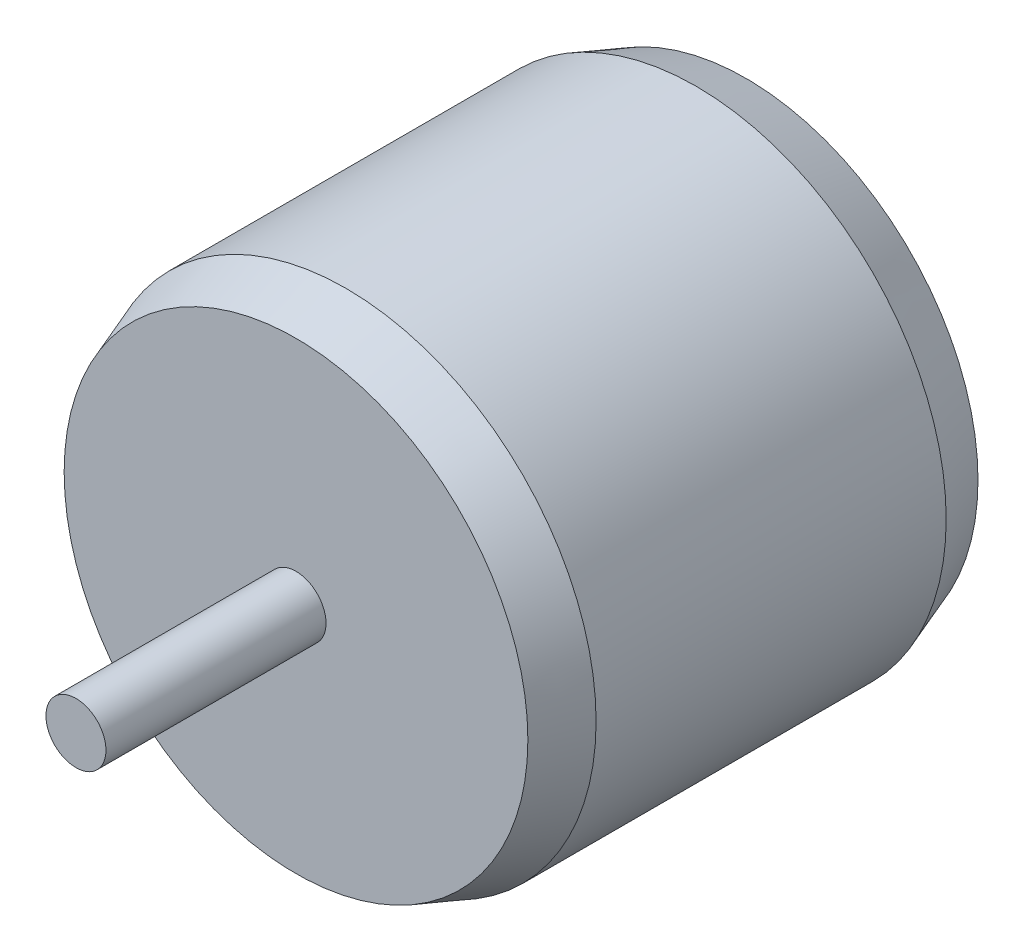
ISO-10303-21;
HEADER;
FILE_DESCRIPTION(('STEP AP214'),'2;1');
FILE_NAME('part.step','',(''),(''),'','','');
FILE_SCHEMA(('AUTOMOTIVE_DESIGN { 1 0 10303 214 1 1 1 1 }'));
ENDSEC;
DATA;
#1=APPLICATION_CONTEXT('core data for automotive mechanical design processes');
#2=APPLICATION_PROTOCOL_DEFINITION('international standard','automotive_design',2000,#1);
#3=PRODUCT_CONTEXT('',#1,'mechanical');
#4=PRODUCT('Part','Part','',(#3));
#5=PRODUCT_RELATED_PRODUCT_CATEGORY('part','',(#4));
#6=PRODUCT_DEFINITION_FORMATION('','',#4);
#7=PRODUCT_DEFINITION_CONTEXT('part definition',#1,'design');
#8=PRODUCT_DEFINITION('design','',#6,#7);
#9=PRODUCT_DEFINITION_SHAPE('','',#8);
#10=(LENGTH_UNIT() NAMED_UNIT(*) SI_UNIT(.MILLI.,.METRE.));
#11=(NAMED_UNIT(*) PLANE_ANGLE_UNIT() SI_UNIT($,.RADIAN.));
#12=(NAMED_UNIT(*) SI_UNIT($,.STERADIAN.) SOLID_ANGLE_UNIT());
#13=UNCERTAINTY_MEASURE_WITH_UNIT(LENGTH_MEASURE(1.E-05),#10,'distance_accuracy_value','');
#14=(GEOMETRIC_REPRESENTATION_CONTEXT(3) GLOBAL_UNCERTAINTY_ASSIGNED_CONTEXT((#13)) GLOBAL_UNIT_ASSIGNED_CONTEXT((#10,
#11,#12)) REPRESENTATION_CONTEXT('',''));
#15=CARTESIAN_POINT('',(0.,0.,0.));
#16=DIRECTION('',(0.,0.,1.));
#17=DIRECTION('',(1.,0.,0.));
#18=AXIS2_PLACEMENT_3D('',#15,#16,#17);
#19=CARTESIAN_POINT('',(0.,0.,0.));
#20=DIRECTION('',(0.,0.,1.));
#21=DIRECTION('',(1.,0.,0.));
#22=AXIS2_PLACEMENT_3D('',#19,#20,#21);
#23=PLANE('',#22);
#24=CARTESIAN_POINT('',(0.,-10.,0.));
#25=DIRECTION('',(0.,0.,-1.));
#26=DIRECTION('',(-1.,0.,0.));
#27=AXIS2_PLACEMENT_3D('',#24,#25,#26);
#28=CIRCLE('',#27,1.24999999999999);
#29=CARTESIAN_POINT('',(-1.24999999999999,-10.,0.));
#30=VERTEX_POINT('',#29);
#31=EDGE_CURVE('E83',#30,#30,#28,.T.);
#32=ORIENTED_EDGE('',*,*,#31,.F.);
#33=EDGE_LOOP('',(#32));
#34=FACE_BOUND('',#33,.T.);
#35=CARTESIAN_POINT('',(-10.,0.,0.));
#36=DIRECTION('',(0.,0.,-1.));
#37=DIRECTION('',(-1.,0.,0.));
#38=AXIS2_PLACEMENT_3D('',#35,#36,#37);
#39=CIRCLE('',#38,1.24999999999999);
#40=CARTESIAN_POINT('',(-11.25,0.,0.));
#41=VERTEX_POINT('',#40);
#42=EDGE_CURVE('E97',#41,#41,#39,.T.);
#43=ORIENTED_EDGE('',*,*,#42,.F.);
#44=EDGE_LOOP('',(#43));
#45=FACE_BOUND('',#44,.T.);
#46=CARTESIAN_POINT('',(0.,10.,0.));
#47=DIRECTION('',(0.,0.,-1.));
#48=DIRECTION('',(-1.,0.,0.));
#49=AXIS2_PLACEMENT_3D('',#46,#47,#48);
#50=CIRCLE('',#49,1.24999999999999);
#51=CARTESIAN_POINT('',(-1.24999999999999,10.,0.));
#52=VERTEX_POINT('',#51);
#53=EDGE_CURVE('E105',#52,#52,#50,.T.);
#54=ORIENTED_EDGE('',*,*,#53,.F.);
#55=EDGE_LOOP('',(#54));
#56=FACE_BOUND('',#55,.T.);
#57=CARTESIAN_POINT('',(0.,0.,0.));
#58=DIRECTION('',(0.,0.,1.));
#59=DIRECTION('',(1.,0.,0.));
#60=AXIS2_PLACEMENT_3D('',#57,#58,#59);
#61=CIRCLE('',#60,3.);
#62=CARTESIAN_POINT('',(3.,0.,0.));
#63=VERTEX_POINT('',#62);
#64=EDGE_CURVE('E12',#63,#63,#61,.F.);
#65=ORIENTED_EDGE('',*,*,#64,.F.);
#66=EDGE_LOOP('',(#65));
#67=FACE_BOUND('',#66,.T.);
#68=CARTESIAN_POINT('',(0.,0.,0.));
#69=DIRECTION('',(0.,0.,1.));
#70=DIRECTION('',(1.,0.,0.));
#71=AXIS2_PLACEMENT_3D('',#68,#69,#70);
#72=CIRCLE('',#71,23.180148828669);
#73=CARTESIAN_POINT('',(23.180148828669,0.,0.));
#74=VERTEX_POINT('',#73);
#75=EDGE_CURVE('E133',#74,#74,#72,.F.);
#76=ORIENTED_EDGE('',*,*,#75,.T.);
#77=EDGE_LOOP('',(#76));
#78=FACE_BOUND('',#77,.T.);
#79=CARTESIAN_POINT('',(10.,1.04744440165294E-13,0.));
#80=DIRECTION('',(0.,0.,-1.));
#81=DIRECTION('',(-1.,0.,0.));
#82=AXIS2_PLACEMENT_3D('',#79,#80,#81);
#83=CIRCLE('',#82,1.24999999999999);
#84=CARTESIAN_POINT('',(8.75000000000001,1.04744440165294E-13,0.));
#85=VERTEX_POINT('',#84);
#86=EDGE_CURVE('E84',#85,#85,#83,.T.);
#87=ORIENTED_EDGE('',*,*,#86,.F.);
#88=EDGE_LOOP('',(#87));
#89=FACE_BOUND('',#88,.T.);
#90=ADVANCED_FACE('F49',(#34,#45,#56,#67,#78,#89),#23,.F.);
#91=CARTESIAN_POINT('',(0.,0.,45.));
#92=DIRECTION('',(0.,0.,-1.));
#93=DIRECTION('',(-1.,0.,0.));
#94=AXIS2_PLACEMENT_3D('',#91,#92,#93);
#95=CYLINDRICAL_SURFACE('',#94,25.);
#96=CARTESIAN_POINT('',(0.,0.,4.99999999999999));
#97=DIRECTION('',(0.,0.,1.));
#98=DIRECTION('',(1.,0.,0.));
#99=AXIS2_PLACEMENT_3D('',#96,#97,#98);
#100=CIRCLE('',#99,25.);
#101=CARTESIAN_POINT('',(-25.,0.,4.99999999999998));
#102=VERTEX_POINT('',#101);
#103=EDGE_CURVE('E129',#102,#102,#100,.T.);
#104=CARTESIAN_POINT('',(0.,0.,40.0000000000001));
#105=DIRECTION('',(0.,0.,1.));
#106=DIRECTION('',(1.,0.,0.));
#107=AXIS2_PLACEMENT_3D('',#104,#105,#106);
#108=CIRCLE('',#107,25.);
#109=CARTESIAN_POINT('',(-25.,0.,40.0000000000001));
#110=VERTEX_POINT('',#109);
#111=EDGE_CURVE('E125',#110,#110,#108,.F.);
#112=CARTESIAN_POINT('',(-25.,0.,4.99999999999998));
#113=CARTESIAN_POINT('',(-25.,0.,5.36458333333332));
#114=CARTESIAN_POINT('',(-25.,0.,5.72916666666665));
#115=CARTESIAN_POINT('',(-25.,0.,6.45833333333332));
#116=CARTESIAN_POINT('',(-25.,0.,6.82291666666666));
#117=CARTESIAN_POINT('',(-25.,0.,7.55208333333333));
#118=CARTESIAN_POINT('',(-25.,0.,7.91666666666666));
#119=CARTESIAN_POINT('',(-25.,0.,8.64583333333333));
#120=CARTESIAN_POINT('',(-25.,0.,9.01041666666666));
#121=CARTESIAN_POINT('',(-25.,0.,9.73958333333333));
#122=CARTESIAN_POINT('',(-25.,0.,10.1041666666667));
#123=CARTESIAN_POINT('',(-25.,0.,10.8333333333333));
#124=CARTESIAN_POINT('',(-25.,0.,11.1979166666667));
#125=CARTESIAN_POINT('',(-25.,0.,11.9270833333333));
#126=CARTESIAN_POINT('',(-25.,0.,12.2916666666667));
#127=CARTESIAN_POINT('',(-25.,0.,13.0208333333333));
#128=CARTESIAN_POINT('',(-25.,0.,13.3854166666667));
#129=CARTESIAN_POINT('',(-25.,0.,14.1145833333333));
#130=CARTESIAN_POINT('',(-25.,0.,14.4791666666667));
#131=CARTESIAN_POINT('',(-25.,0.,15.2083333333333));
#132=CARTESIAN_POINT('',(-25.,0.,15.5729166666667));
#133=CARTESIAN_POINT('',(-25.,0.,16.3020833333333));
#134=CARTESIAN_POINT('',(-25.,0.,16.6666666666667));
#135=CARTESIAN_POINT('',(-25.,0.,17.3958333333333));
#136=CARTESIAN_POINT('',(-25.,0.,17.7604166666667));
#137=CARTESIAN_POINT('',(-25.,0.,18.4895833333334));
#138=CARTESIAN_POINT('',(-25.,0.,18.8541666666667));
#139=CARTESIAN_POINT('',(-25.,0.,19.5833333333334));
#140=CARTESIAN_POINT('',(-25.,0.,19.9479166666667));
#141=CARTESIAN_POINT('',(-25.,0.,20.6770833333334));
#142=CARTESIAN_POINT('',(-25.,0.,21.0416666666667));
#143=CARTESIAN_POINT('',(-25.,0.,21.7708333333334));
#144=CARTESIAN_POINT('',(-25.,0.,22.1354166666667));
#145=CARTESIAN_POINT('',(-25.,0.,22.8645833333334));
#146=CARTESIAN_POINT('',(-25.,0.,23.2291666666667));
#147=CARTESIAN_POINT('',(-25.,0.,23.9583333333334));
#148=CARTESIAN_POINT('',(-25.,0.,24.3229166666667));
#149=CARTESIAN_POINT('',(-25.,0.,25.0520833333334));
#150=CARTESIAN_POINT('',(-25.,0.,25.4166666666667));
#151=CARTESIAN_POINT('',(-25.,0.,26.1458333333334));
#152=CARTESIAN_POINT('',(-25.,0.,26.5104166666667));
#153=CARTESIAN_POINT('',(-25.,0.,27.2395833333334));
#154=CARTESIAN_POINT('',(-25.,0.,27.6041666666667));
#155=CARTESIAN_POINT('',(-25.,0.,28.3333333333334));
#156=CARTESIAN_POINT('',(-25.,0.,28.6979166666667));
#157=CARTESIAN_POINT('',(-25.,0.,29.4270833333334));
#158=CARTESIAN_POINT('',(-25.,0.,29.7916666666667));
#159=CARTESIAN_POINT('',(-25.,0.,30.5208333333334));
#160=CARTESIAN_POINT('',(-25.,0.,30.8854166666667));
#161=CARTESIAN_POINT('',(-25.,0.,31.6145833333334));
#162=CARTESIAN_POINT('',(-25.,0.,31.9791666666667));
#163=CARTESIAN_POINT('',(-25.,0.,32.7083333333334));
#164=CARTESIAN_POINT('',(-25.,0.,33.0729166666667));
#165=CARTESIAN_POINT('',(-25.,0.,33.8020833333334));
#166=CARTESIAN_POINT('',(-25.,0.,34.1666666666667));
#167=CARTESIAN_POINT('',(-25.,0.,34.8958333333334));
#168=CARTESIAN_POINT('',(-25.,0.,35.2604166666667));
#169=CARTESIAN_POINT('',(-25.,0.,35.9895833333334));
#170=CARTESIAN_POINT('',(-25.,0.,36.3541666666667));
#171=CARTESIAN_POINT('',(-25.,0.,37.0833333333334));
#172=CARTESIAN_POINT('',(-25.,0.,37.4479166666667));
#173=CARTESIAN_POINT('',(-25.,0.,38.1770833333334));
#174=CARTESIAN_POINT('',(-25.,0.,38.5416666666667));
#175=CARTESIAN_POINT('',(-25.,0.,39.2708333333334));
#176=CARTESIAN_POINT('',(-25.,0.,39.6354166666667));
#177=CARTESIAN_POINT('',(-25.,0.,40.0000000000001));
#178=B_SPLINE_CURVE_WITH_KNOTS('',3,(#112,#113,#114,#115,#116,#117,#118,#119,#120,#121,#122,
#123,#124,#125,#126,#127,#128,#129,#130,#131,#132,#133,#134,#135,#136,#137,#138,#139,#140,#141,
#142,#143,#144,#145,#146,#147,#148,#149,#150,#151,#152,#153,#154,#155,#156,#157,#158,#159,#160,
#161,#162,#163,#164,#165,#166,#167,#168,#169,#170,#171,#172,#173,#174,#175,#176,#177),
.UNSPECIFIED.,.F.,.F.,(4,2,2,2,2,2,2,2,2,2,2,2,2,2,2,2,2,2,2,2,2,2,2,2,2,2,2,2,2,2,2,2,4),(0.,
1.09375,2.18750000000001,3.28125000000001,4.37500000000001,5.46875000000002,6.56250000000002,
7.65625000000002,8.75000000000002,9.84375000000002,10.9375,12.03125,13.125,14.21875,15.3125,
16.40625,17.5,18.59375,19.6875000000001,20.7812500000001,21.8750000000001,22.9687500000001,
24.0625000000001,25.1562500000001,26.2500000000001,27.3437500000001,28.4375000000001,
29.5312500000001,30.6250000000001,31.7187500000001,32.8125000000001,33.9062500000001,
35.0000000000001),.UNSPECIFIED.);
#179=EDGE_CURVE('BSEAM157',#102,#110,#178,.T.);
#180=ORIENTED_EDGE('',*,*,#103,.T.);
#181=ORIENTED_EDGE('',*,*,#111,.T.);
#182=ORIENTED_EDGE('',*,*,#179,.T.);
#183=ORIENTED_EDGE('',*,*,#179,.F.);
#184=EDGE_LOOP('',(#180,#182,#181,#183));
#185=FACE_BOUND('',#184,.T.);
#186=ADVANCED_FACE('F157',(#185),#95,.T.);
#187=CARTESIAN_POINT('',(0.,0.,45.));
#188=DIRECTION('',(0.,0.,1.));
#189=DIRECTION('',(1.,0.,0.));
#190=AXIS2_PLACEMENT_3D('',#187,#188,#189);
#191=PLANE('',#190);
#192=CARTESIAN_POINT('',(0.,0.,45.));
#193=DIRECTION('',(0.,0.,1.));
#194=DIRECTION('',(1.,0.,0.));
#195=AXIS2_PLACEMENT_3D('',#192,#193,#194);
#196=CIRCLE('',#195,3.);
#197=CARTESIAN_POINT('',(3.,0.,45.));
#198=VERTEX_POINT('',#197);
#199=EDGE_CURVE('E117',#198,#198,#196,.T.);
#200=ORIENTED_EDGE('',*,*,#199,.F.);
#201=EDGE_LOOP('',(#200));
#202=FACE_BOUND('',#201,.T.);
#203=CARTESIAN_POINT('',(0.,0.,45.));
#204=DIRECTION('',(0.,0.,1.));
#205=DIRECTION('',(1.,0.,0.));
#206=AXIS2_PLACEMENT_3D('',#203,#204,#205);
#207=CIRCLE('',#206,23.180148828669);
#208=CARTESIAN_POINT('',(23.180148828669,0.,45.));
#209=VERTEX_POINT('',#208);
#210=EDGE_CURVE('E59',#209,#209,#207,.T.);
#211=ORIENTED_EDGE('',*,*,#210,.T.);
#212=EDGE_LOOP('',(#211));
#213=FACE_BOUND('',#212,.T.);
#214=ADVANCED_FACE('F140',(#202,#213),#191,.T.);
#215=CARTESIAN_POINT('',(0.,0.,4.99999999999999));
#216=DIRECTION('',(0.,0.,1.));
#217=DIRECTION('',(1.,0.,0.));
#218=AXIS2_PLACEMENT_3D('',#215,#216,#217);
#219=CONICAL_SURFACE('',#218,25.,0.349065850398863);
#220=ORIENTED_EDGE('',*,*,#75,.F.);
#221=EDGE_LOOP('',(#220));
#222=FACE_BOUND('',#221,.T.);
#223=ORIENTED_EDGE('',*,*,#103,.F.);
#224=EDGE_LOOP('',(#223));
#225=FACE_BOUND('',#224,.T.);
#226=ADVANCED_FACE('F144',(#222,#225),#219,.T.);
#227=CARTESIAN_POINT('',(0.,0.,45.));
#228=DIRECTION('',(0.,0.,-1.));
#229=DIRECTION('',(-1.,0.,0.));
#230=AXIS2_PLACEMENT_3D('',#227,#228,#229);
#231=CONICAL_SURFACE('',#230,23.180148828669,0.349065850398865);
#232=ORIENTED_EDGE('',*,*,#111,.F.);
#233=EDGE_LOOP('',(#232));
#234=FACE_BOUND('',#233,.T.);
#235=ORIENTED_EDGE('',*,*,#210,.F.);
#236=EDGE_LOOP('',(#235));
#237=FACE_BOUND('',#236,.T.);
#238=ADVANCED_FACE('F52',(#234,#237),#231,.T.);
#239=CARTESIAN_POINT('',(0.,0.,142.485281374239));
#240=DIRECTION('',(0.,0.,-1.));
#241=DIRECTION('',(-1.,0.,0.));
#242=AXIS2_PLACEMENT_3D('',#239,#240,#241);
#243=CYLINDRICAL_SURFACE('',#242,3.);
#244=ORIENTED_EDGE('',*,*,#199,.T.);
#245=EDGE_LOOP('',(#244));
#246=FACE_BOUND('',#245,.T.);
#247=CARTESIAN_POINT('',(0.,0.,67.));
#248=DIRECTION('',(0.,0.,1.));
#249=DIRECTION('',(1.,0.,0.));
#250=AXIS2_PLACEMENT_3D('',#247,#248,#249);
#251=CIRCLE('',#250,3.);
#252=CARTESIAN_POINT('',(3.,0.,67.));
#253=VERTEX_POINT('',#252);
#254=EDGE_CURVE('E121',#253,#253,#251,.T.);
#255=ORIENTED_EDGE('',*,*,#254,.F.);
#256=EDGE_LOOP('',(#255));
#257=FACE_BOUND('',#256,.T.);
#258=ADVANCED_FACE('F143',(#246,#257),#243,.T.);
#259=CARTESIAN_POINT('',(0.,0.,67.));
#260=DIRECTION('',(0.,0.,1.));
#261=DIRECTION('',(1.,0.,0.));
#262=AXIS2_PLACEMENT_3D('',#259,#260,#261);
#263=PLANE('',#262);
#264=ORIENTED_EDGE('',*,*,#254,.T.);
#265=EDGE_LOOP('',(#264));
#266=FACE_BOUND('',#265,.T.);
#267=ADVANCED_FACE('F151',(#266),#263,.T.);
#268=CARTESIAN_POINT('',(0.,0.,-2.));
#269=DIRECTION('',(0.,0.,1.));
#270=DIRECTION('',(1.,0.,0.));
#271=AXIS2_PLACEMENT_3D('',#268,#269,#270);
#272=CYLINDRICAL_SURFACE('',#271,3.);
#273=CARTESIAN_POINT('',(0.,0.,-2.));
#274=DIRECTION('',(0.,0.,-1.));
#275=DIRECTION('',(-1.,0.,0.));
#276=AXIS2_PLACEMENT_3D('',#273,#274,#275);
#277=CIRCLE('',#276,3.);
#278=CARTESIAN_POINT('',(-3.,0.,-2.));
#279=VERTEX_POINT('',#278);
#280=EDGE_CURVE('E113',#279,#279,#277,.T.);
#281=ORIENTED_EDGE('',*,*,#280,.F.);
#282=EDGE_LOOP('',(#281));
#283=FACE_BOUND('',#282,.T.);
#284=ORIENTED_EDGE('',*,*,#64,.T.);
#285=EDGE_LOOP('',(#284));
#286=FACE_BOUND('',#285,.T.);
#287=ADVANCED_FACE('F178',(#283,#286),#272,.T.);
#288=CARTESIAN_POINT('',(0.,0.,-2.));
#289=DIRECTION('',(0.,0.,-1.));
#290=DIRECTION('',(-1.,0.,0.));
#291=AXIS2_PLACEMENT_3D('',#288,#289,#290);
#292=PLANE('',#291);
#293=ORIENTED_EDGE('',*,*,#280,.T.);
#294=EDGE_LOOP('',(#293));
#295=FACE_BOUND('',#294,.T.);
#296=ADVANCED_FACE('F183',(#295),#292,.T.);
#297=CARTESIAN_POINT('',(0.,10.,10.));
#298=DIRECTION('',(0.,0.,-1.));
#299=DIRECTION('',(-1.,0.,0.));
#300=AXIS2_PLACEMENT_3D('',#297,#298,#299);
#301=CONICAL_SURFACE('',#300,1.24999999999999,1.02974425867665);
#302=CARTESIAN_POINT('',(0.,10.,10.7510757737845));
#303=VERTEX_POINT('',#302);
#304=VERTEX_LOOP('',#303);
#305=FACE_BOUND('',#304,.T.);
#306=CARTESIAN_POINT('',(0.,10.,10.));
#307=DIRECTION('',(0.,0.,-1.));
#308=DIRECTION('',(-1.,0.,0.));
#309=AXIS2_PLACEMENT_3D('',#306,#307,#308);
#310=CIRCLE('',#309,1.24999999999999);
#311=CARTESIAN_POINT('',(-1.24999999999999,10.,10.));
#312=VERTEX_POINT('',#311);
#313=EDGE_CURVE('E109',#312,#312,#310,.T.);
#314=ORIENTED_EDGE('',*,*,#313,.T.);
#315=EDGE_LOOP('',(#314));
#316=FACE_BOUND('',#315,.T.);
#317=ADVANCED_FACE('F187',(#305,#316),#301,.F.);
#318=CARTESIAN_POINT('',(0.,10.,0.));
#319=DIRECTION('',(0.,0.,-1.));
#320=DIRECTION('',(-1.,0.,0.));
#321=AXIS2_PLACEMENT_3D('',#318,#319,#320);
#322=CYLINDRICAL_SURFACE('',#321,1.24999999999999);
#323=ORIENTED_EDGE('',*,*,#313,.F.);
#324=EDGE_LOOP('',(#323));
#325=FACE_BOUND('',#324,.T.);
#326=ORIENTED_EDGE('',*,*,#53,.T.);
#327=EDGE_LOOP('',(#326));
#328=FACE_BOUND('',#327,.T.);
#329=ADVANCED_FACE('F191',(#325,#328),#322,.F.);
#330=CARTESIAN_POINT('',(-10.,0.,10.));
#331=DIRECTION('',(0.,0.,-1.));
#332=DIRECTION('',(-1.,0.,0.));
#333=AXIS2_PLACEMENT_3D('',#330,#331,#332);
#334=CONICAL_SURFACE('',#333,1.24999999999999,1.02974425867665);
#335=CARTESIAN_POINT('',(-10.,0.,10.7510757737845));
#336=VERTEX_POINT('',#335);
#337=VERTEX_LOOP('',#336);
#338=FACE_BOUND('',#337,.T.);
#339=CARTESIAN_POINT('',(-10.,0.,10.));
#340=DIRECTION('',(0.,0.,-1.));
#341=DIRECTION('',(-1.,0.,0.));
#342=AXIS2_PLACEMENT_3D('',#339,#340,#341);
#343=CIRCLE('',#342,1.24999999999999);
#344=CARTESIAN_POINT('',(-11.25,0.,10.));
#345=VERTEX_POINT('',#344);
#346=EDGE_CURVE('E101',#345,#345,#343,.T.);
#347=ORIENTED_EDGE('',*,*,#346,.T.);
#348=EDGE_LOOP('',(#347));
#349=FACE_BOUND('',#348,.T.);
#350=ADVANCED_FACE('F193',(#338,#349),#334,.F.);
#351=CARTESIAN_POINT('',(-10.,0.,0.));
#352=DIRECTION('',(0.,0.,-1.));
#353=DIRECTION('',(-1.,0.,0.));
#354=AXIS2_PLACEMENT_3D('',#351,#352,#353);
#355=CYLINDRICAL_SURFACE('',#354,1.24999999999999);
#356=ORIENTED_EDGE('',*,*,#346,.F.);
#357=EDGE_LOOP('',(#356));
#358=FACE_BOUND('',#357,.T.);
#359=ORIENTED_EDGE('',*,*,#42,.T.);
#360=EDGE_LOOP('',(#359));
#361=FACE_BOUND('',#360,.T.);
#362=ADVANCED_FACE('F196',(#358,#361),#355,.F.);
#363=CARTESIAN_POINT('',(0.,-10.,10.));
#364=DIRECTION('',(0.,0.,-1.));
#365=DIRECTION('',(-1.,0.,0.));
#366=AXIS2_PLACEMENT_3D('',#363,#364,#365);
#367=CONICAL_SURFACE('',#366,1.24999999999999,1.02974425867665);
#368=CARTESIAN_POINT('',(0.,-10.,10.7510757737845));
#369=VERTEX_POINT('',#368);
#370=VERTEX_LOOP('',#369);
#371=FACE_BOUND('',#370,.T.);
#372=CARTESIAN_POINT('',(0.,-10.,10.));
#373=DIRECTION('',(0.,0.,-1.));
#374=DIRECTION('',(-1.,0.,0.));
#375=AXIS2_PLACEMENT_3D('',#372,#373,#374);
#376=CIRCLE('',#375,1.24999999999999);
#377=CARTESIAN_POINT('',(-1.24999999999999,-10.,10.));
#378=VERTEX_POINT('',#377);
#379=EDGE_CURVE('E89',#378,#378,#376,.T.);
#380=ORIENTED_EDGE('',*,*,#379,.T.);
#381=EDGE_LOOP('',(#380));
#382=FACE_BOUND('',#381,.T.);
#383=ADVANCED_FACE('F199',(#371,#382),#367,.F.);
#384=CARTESIAN_POINT('',(0.,-10.,0.));
#385=DIRECTION('',(0.,0.,-1.));
#386=DIRECTION('',(-1.,0.,0.));
#387=AXIS2_PLACEMENT_3D('',#384,#385,#386);
#388=CYLINDRICAL_SURFACE('',#387,1.24999999999999);
#389=ORIENTED_EDGE('',*,*,#379,.F.);
#390=EDGE_LOOP('',(#389));
#391=FACE_BOUND('',#390,.T.);
#392=ORIENTED_EDGE('',*,*,#31,.T.);
#393=EDGE_LOOP('',(#392));
#394=FACE_BOUND('',#393,.T.);
#395=ADVANCED_FACE('F76',(#391,#394),#388,.F.);
#396=CARTESIAN_POINT('',(10.,1.04744440165294E-13,10.));
#397=DIRECTION('',(0.,0.,-1.));
#398=DIRECTION('',(-1.,0.,0.));
#399=AXIS2_PLACEMENT_3D('',#396,#397,#398);
#400=CONICAL_SURFACE('',#399,1.24999999999999,1.02974425867665);
#401=CARTESIAN_POINT('',(10.,1.04744440165294E-13,10.7510757737845));
#402=VERTEX_POINT('',#401);
#403=VERTEX_LOOP('',#402);
#404=FACE_BOUND('',#403,.T.);
#405=CARTESIAN_POINT('',(10.,1.04744440165294E-13,10.));
#406=DIRECTION('',(0.,0.,-1.));
#407=DIRECTION('',(-1.,0.,0.));
#408=AXIS2_PLACEMENT_3D('',#405,#406,#407);
#409=CIRCLE('',#408,1.24999999999999);
#410=CARTESIAN_POINT('',(8.75000000000001,1.04744440165294E-13,10.));
#411=VERTEX_POINT('',#410);
#412=EDGE_CURVE('E80',#411,#411,#409,.T.);
#413=ORIENTED_EDGE('',*,*,#412,.T.);
#414=EDGE_LOOP('',(#413));
#415=FACE_BOUND('',#414,.T.);
#416=ADVANCED_FACE('F72',(#404,#415),#400,.F.);
#417=CARTESIAN_POINT('',(10.,1.04744440165294E-13,0.));
#418=DIRECTION('',(0.,0.,-1.));
#419=DIRECTION('',(-1.,0.,0.));
#420=AXIS2_PLACEMENT_3D('',#417,#418,#419);
#421=CYLINDRICAL_SURFACE('',#420,1.24999999999999);
#422=ORIENTED_EDGE('',*,*,#412,.F.);
#423=EDGE_LOOP('',(#422));
#424=FACE_BOUND('',#423,.T.);
#425=ORIENTED_EDGE('',*,*,#86,.T.);
#426=EDGE_LOOP('',(#425));
#427=FACE_BOUND('',#426,.T.);
#428=ADVANCED_FACE('F75',(#424,#427),#421,.F.);
#429=CLOSED_SHELL('',(#90,#186,#214,#226,#238,#258,#267,#287,#296,#317,#329,#350,#362,#383,#395,
#416,#428));
#430=MANIFOLD_SOLID_BREP('B2',#429);
#431=ADVANCED_BREP_SHAPE_REPRESENTATION('',(#18,#430),#14);
#432=SHAPE_DEFINITION_REPRESENTATION(#9,#431);
ENDSEC;
END-ISO-10303-21;
